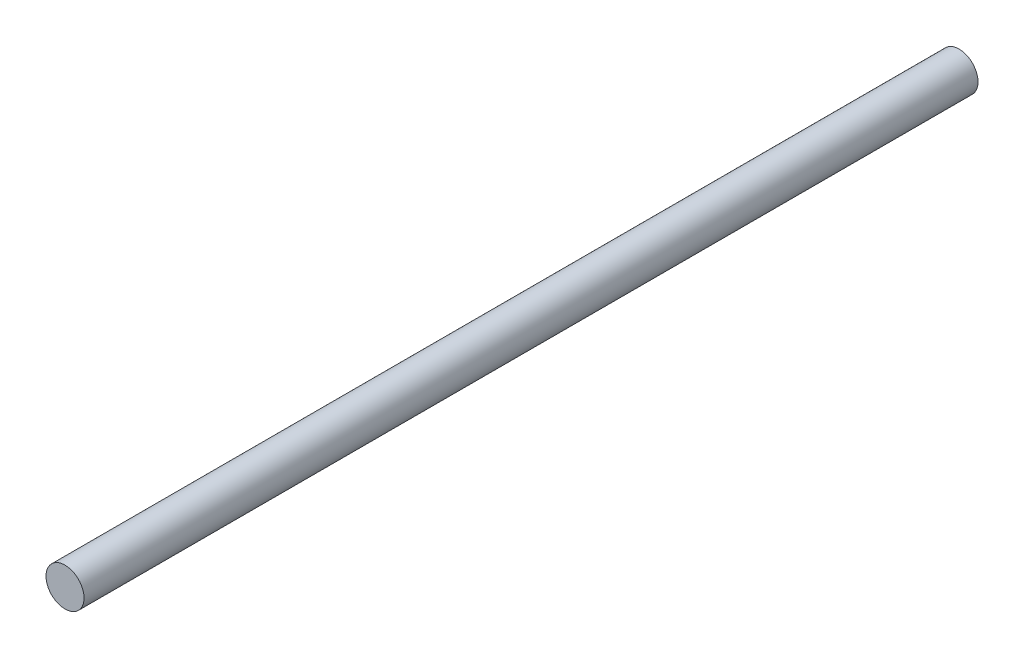
ISO-10303-21;
HEADER;
FILE_DESCRIPTION(('STEP AP214'),'2;1');
FILE_NAME('part.step','',(''),(''),'','','');
FILE_SCHEMA(('AUTOMOTIVE_DESIGN { 1 0 10303 214 1 1 1 1 }'));
ENDSEC;
DATA;
#1=APPLICATION_CONTEXT('core data for automotive mechanical design processes');
#2=APPLICATION_PROTOCOL_DEFINITION('international standard','automotive_design',2000,#1);
#3=PRODUCT_CONTEXT('',#1,'mechanical');
#4=PRODUCT('Part','Part','',(#3));
#5=PRODUCT_RELATED_PRODUCT_CATEGORY('part','',(#4));
#6=PRODUCT_DEFINITION_FORMATION('','',#4);
#7=PRODUCT_DEFINITION_CONTEXT('part definition',#1,'design');
#8=PRODUCT_DEFINITION('design','',#6,#7);
#9=PRODUCT_DEFINITION_SHAPE('','',#8);
#10=(LENGTH_UNIT() NAMED_UNIT(*) SI_UNIT(.MILLI.,.METRE.));
#11=(NAMED_UNIT(*) PLANE_ANGLE_UNIT() SI_UNIT($,.RADIAN.));
#12=(NAMED_UNIT(*) SI_UNIT($,.STERADIAN.) SOLID_ANGLE_UNIT());
#13=UNCERTAINTY_MEASURE_WITH_UNIT(LENGTH_MEASURE(1.E-05),#10,'distance_accuracy_value','');
#14=(GEOMETRIC_REPRESENTATION_CONTEXT(3) GLOBAL_UNCERTAINTY_ASSIGNED_CONTEXT((#13)) GLOBAL_UNIT_ASSIGNED_CONTEXT((#10,
#11,#12)) REPRESENTATION_CONTEXT('',''));
#15=CARTESIAN_POINT('',(0.,0.,0.));
#16=DIRECTION('',(0.,0.,1.));
#17=DIRECTION('',(1.,0.,0.));
#18=AXIS2_PLACEMENT_3D('',#15,#16,#17);
#19=CARTESIAN_POINT('',(0.,0.,470.));
#20=DIRECTION('',(0.,0.,-1.));
#21=DIRECTION('',(-1.,0.,0.));
#22=AXIS2_PLACEMENT_3D('',#19,#20,#21);
#23=CYLINDRICAL_SURFACE('',#22,10.);
#24=CARTESIAN_POINT('',(0.,0.,470.));
#25=DIRECTION('',(0.,0.,1.));
#26=DIRECTION('',(1.,0.,0.));
#27=AXIS2_PLACEMENT_3D('',#24,#25,#26);
#28=CIRCLE('',#27,10.);
#29=CARTESIAN_POINT('',(-10.,0.,470.));
#30=VERTEX_POINT('',#29);
#31=EDGE_CURVE('E10',#30,#30,#28,.T.);
#32=CARTESIAN_POINT('',(0.,0.,0.));
#33=DIRECTION('',(0.,0.,1.));
#34=DIRECTION('',(1.,0.,0.));
#35=AXIS2_PLACEMENT_3D('',#32,#33,#34);
#36=CIRCLE('',#35,10.);
#37=CARTESIAN_POINT('',(-10.,0.,0.));
#38=VERTEX_POINT('',#37);
#39=EDGE_CURVE('E44',#38,#38,#36,.T.);
#40=CARTESIAN_POINT('',(-10.,0.,470.));
#41=CARTESIAN_POINT('',(-10.,0.,465.104166666667));
#42=CARTESIAN_POINT('',(-10.,0.,460.208333333333));
#43=CARTESIAN_POINT('',(-10.,0.,450.416666666667));
#44=CARTESIAN_POINT('',(-10.,0.,445.520833333333));
#45=CARTESIAN_POINT('',(-10.,0.,435.729166666667));
#46=CARTESIAN_POINT('',(-10.,0.,430.833333333333));
#47=CARTESIAN_POINT('',(-10.,0.,421.041666666667));
#48=CARTESIAN_POINT('',(-10.,0.,416.145833333333));
#49=CARTESIAN_POINT('',(-10.,0.,406.354166666667));
#50=CARTESIAN_POINT('',(-10.,0.,401.458333333333));
#51=CARTESIAN_POINT('',(-10.,0.,391.666666666667));
#52=CARTESIAN_POINT('',(-10.,0.,386.770833333333));
#53=CARTESIAN_POINT('',(-10.,0.,376.979166666667));
#54=CARTESIAN_POINT('',(-10.,0.,372.083333333333));
#55=CARTESIAN_POINT('',(-10.,0.,362.291666666667));
#56=CARTESIAN_POINT('',(-10.,0.,357.395833333333));
#57=CARTESIAN_POINT('',(-10.,0.,347.604166666667));
#58=CARTESIAN_POINT('',(-10.,0.,342.708333333333));
#59=CARTESIAN_POINT('',(-10.,0.,332.916666666667));
#60=CARTESIAN_POINT('',(-10.,0.,328.020833333333));
#61=CARTESIAN_POINT('',(-10.,0.,318.229166666667));
#62=CARTESIAN_POINT('',(-10.,0.,313.333333333333));
#63=CARTESIAN_POINT('',(-10.,0.,303.541666666667));
#64=CARTESIAN_POINT('',(-10.,0.,298.645833333333));
#65=CARTESIAN_POINT('',(-10.,0.,288.854166666667));
#66=CARTESIAN_POINT('',(-10.,0.,283.958333333333));
#67=CARTESIAN_POINT('',(-10.,0.,274.166666666667));
#68=CARTESIAN_POINT('',(-10.,0.,269.270833333333));
#69=CARTESIAN_POINT('',(-10.,0.,259.479166666667));
#70=CARTESIAN_POINT('',(-10.,0.,254.583333333333));
#71=CARTESIAN_POINT('',(-10.,0.,244.791666666667));
#72=CARTESIAN_POINT('',(-10.,0.,239.895833333333));
#73=CARTESIAN_POINT('',(-10.,0.,230.104166666667));
#74=CARTESIAN_POINT('',(-10.,0.,225.208333333333));
#75=CARTESIAN_POINT('',(-10.,0.,215.416666666667));
#76=CARTESIAN_POINT('',(-10.,0.,210.520833333333));
#77=CARTESIAN_POINT('',(-10.,0.,200.729166666667));
#78=CARTESIAN_POINT('',(-10.,0.,195.833333333333));
#79=CARTESIAN_POINT('',(-10.,0.,186.041666666667));
#80=CARTESIAN_POINT('',(-10.,0.,181.145833333333));
#81=CARTESIAN_POINT('',(-10.,0.,171.354166666667));
#82=CARTESIAN_POINT('',(-10.,0.,166.458333333333));
#83=CARTESIAN_POINT('',(-10.,0.,156.666666666667));
#84=CARTESIAN_POINT('',(-10.,0.,151.770833333333));
#85=CARTESIAN_POINT('',(-10.,0.,141.979166666667));
#86=CARTESIAN_POINT('',(-10.,0.,137.083333333333));
#87=CARTESIAN_POINT('',(-10.,0.,127.291666666667));
#88=CARTESIAN_POINT('',(-10.,0.,122.395833333333));
#89=CARTESIAN_POINT('',(-10.,0.,112.604166666667));
#90=CARTESIAN_POINT('',(-10.,0.,107.708333333333));
#91=CARTESIAN_POINT('',(-10.,0.,97.9166666666666));
#92=CARTESIAN_POINT('',(-10.,0.,93.0208333333333));
#93=CARTESIAN_POINT('',(-10.,0.,83.2291666666666));
#94=CARTESIAN_POINT('',(-10.,0.,78.3333333333333));
#95=CARTESIAN_POINT('',(-10.,0.,68.5416666666666));
#96=CARTESIAN_POINT('',(-10.,0.,63.6458333333333));
#97=CARTESIAN_POINT('',(-10.,0.,53.8541666666666));
#98=CARTESIAN_POINT('',(-10.,0.,48.9583333333333));
#99=CARTESIAN_POINT('',(-10.,0.,39.1666666666666));
#100=CARTESIAN_POINT('',(-10.,0.,34.2708333333333));
#101=CARTESIAN_POINT('',(-10.,0.,24.4791666666666));
#102=CARTESIAN_POINT('',(-10.,0.,19.5833333333333));
#103=CARTESIAN_POINT('',(-10.,0.,9.79166666666662));
#104=CARTESIAN_POINT('',(-10.,0.,4.89583333333328));
#105=CARTESIAN_POINT('',(-10.,0.,0.));
#106=B_SPLINE_CURVE_WITH_KNOTS('',3,(#40,#41,#42,#43,#44,#45,#46,#47,#48,#49,#50,#51,#52,#53,
#54,#55,#56,#57,#58,#59,#60,#61,#62,#63,#64,#65,#66,#67,#68,#69,#70,#71,#72,#73,#74,#75,#76,#77,
#78,#79,#80,#81,#82,#83,#84,#85,#86,#87,#88,#89,#90,#91,#92,#93,#94,#95,#96,#97,#98,#99,#100,
#101,#102,#103,#104,#105),.UNSPECIFIED.,.F.,.F.,(4,2,2,2,2,2,2,2,2,2,2,2,2,2,2,2,2,2,2,2,2,2,2,
2,2,2,2,2,2,2,2,2,4),(0.,14.6875,29.375,44.0625,58.75,73.4375,88.125,102.8125,117.5,132.1875,
146.875,161.5625,176.25,190.9375,205.625,220.3125,235.,249.6875,264.375,279.0625,293.75,
308.4375,323.125,337.8125,352.5,367.1875,381.875,396.5625,411.25,425.9375,440.625,455.3125,
470.),.UNSPECIFIED.);
#107=EDGE_CURVE('BSEAM41',#30,#38,#106,.T.);
#108=ORIENTED_EDGE('',*,*,#31,.F.);
#109=ORIENTED_EDGE('',*,*,#39,.T.);
#110=ORIENTED_EDGE('',*,*,#107,.T.);
#111=ORIENTED_EDGE('',*,*,#107,.F.);
#112=EDGE_LOOP('',(#108,#110,#109,#111));
#113=FACE_BOUND('',#112,.T.);
#114=ADVANCED_FACE('F41',(#113),#23,.T.);
#115=CARTESIAN_POINT('',(0.,0.,470.));
#116=DIRECTION('',(0.,0.,1.));
#117=DIRECTION('',(1.,0.,0.));
#118=AXIS2_PLACEMENT_3D('',#115,#116,#117);
#119=PLANE('',#118);
#120=ORIENTED_EDGE('',*,*,#31,.T.);
#121=EDGE_LOOP('',(#120));
#122=FACE_BOUND('',#121,.T.);
#123=ADVANCED_FACE('F58',(#122),#119,.T.);
#124=CARTESIAN_POINT('',(0.,0.,0.));
#125=DIRECTION('',(0.,0.,1.));
#126=DIRECTION('',(1.,0.,0.));
#127=AXIS2_PLACEMENT_3D('',#124,#125,#126);
#128=PLANE('',#127);
#129=ORIENTED_EDGE('',*,*,#39,.F.);
#130=EDGE_LOOP('',(#129));
#131=FACE_BOUND('',#130,.T.);
#132=ADVANCED_FACE('F56',(#131),#128,.F.);
#133=CLOSED_SHELL('',(#114,#123,#132));
#134=MANIFOLD_SOLID_BREP('B2',#133);
#135=ADVANCED_BREP_SHAPE_REPRESENTATION('',(#18,#134),#14);
#136=SHAPE_DEFINITION_REPRESENTATION(#9,#135);
ENDSEC;
END-ISO-10303-21;
